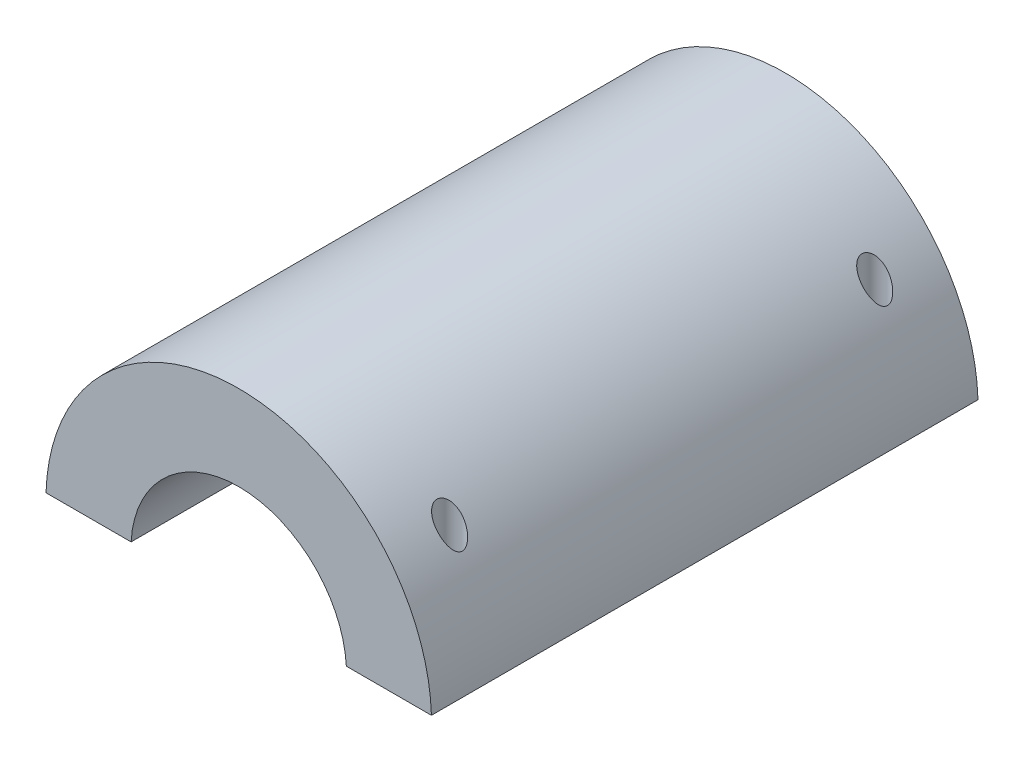
ISO-10303-21;
HEADER;
FILE_DESCRIPTION(('STEP AP214'),'2;1');
FILE_NAME('part.step','',(''),(''),'','','');
FILE_SCHEMA(('AUTOMOTIVE_DESIGN { 1 0 10303 214 1 1 1 1 }'));
ENDSEC;
DATA;
#1=APPLICATION_CONTEXT('core data for automotive mechanical design processes');
#2=APPLICATION_PROTOCOL_DEFINITION('international standard','automotive_design',2000,#1);
#3=PRODUCT_CONTEXT('',#1,'mechanical');
#4=PRODUCT('Part','Part','',(#3));
#5=PRODUCT_RELATED_PRODUCT_CATEGORY('part','',(#4));
#6=PRODUCT_DEFINITION_FORMATION('','',#4);
#7=PRODUCT_DEFINITION_CONTEXT('part definition',#1,'design');
#8=PRODUCT_DEFINITION('design','',#6,#7);
#9=PRODUCT_DEFINITION_SHAPE('','',#8);
#10=(LENGTH_UNIT() NAMED_UNIT(*) SI_UNIT(.MILLI.,.METRE.));
#11=(NAMED_UNIT(*) PLANE_ANGLE_UNIT() SI_UNIT($,.RADIAN.));
#12=(NAMED_UNIT(*) SI_UNIT($,.STERADIAN.) SOLID_ANGLE_UNIT());
#13=UNCERTAINTY_MEASURE_WITH_UNIT(LENGTH_MEASURE(1.E-05),#10,'distance_accuracy_value','');
#14=(GEOMETRIC_REPRESENTATION_CONTEXT(3) GLOBAL_UNCERTAINTY_ASSIGNED_CONTEXT((#13)) GLOBAL_UNIT_ASSIGNED_CONTEXT((#10,
#11,#12)) REPRESENTATION_CONTEXT('',''));
#15=CARTESIAN_POINT('',(0.,0.,0.));
#16=DIRECTION('',(0.,0.,1.));
#17=DIRECTION('',(1.,0.,0.));
#18=AXIS2_PLACEMENT_3D('',#15,#16,#17);
#19=CARTESIAN_POINT('',(17.7218085984473,1.,90.));
#20=DIRECTION('',(0.,1.,0.));
#21=DIRECTION('',(0.,0.,1.));
#22=AXIS2_PLACEMENT_3D('',#19,#20,#21);
#23=PLANE('',#22);
#24=CARTESIAN_POINT('',(24.7280283297466,1.,80.));
#25=DIRECTION('',(0.,-1.,0.));
#26=DIRECTION('',(0.,0.,-1.));
#27=AXIS2_PLACEMENT_3D('',#24,#25,#26);
#28=CIRCLE('',#27,2.1);
#29=CARTESIAN_POINT('',(24.7280283297466,1.,77.9));
#30=VERTEX_POINT('',#29);
#31=EDGE_CURVE('E145',#30,#30,#28,.T.);
#32=ORIENTED_EDGE('',*,*,#31,.F.);
#33=EDGE_LOOP('',(#32));
#34=FACE_BOUND('',#33,.T.);
#35=DIRECTION('',(1.,0.,0.));
#36=VECTOR('',#35,1.);
#37=CARTESIAN_POINT('',(17.7218085984473,1.,0.));
#38=LINE('',#37,#36);
#39=CARTESIAN_POINT('',(17.7218085984473,1.,0.));
#40=VERTEX_POINT('',#39);
#41=CARTESIAN_POINT('',(31.734248061046,1.,0.));
#42=VERTEX_POINT('',#41);
#43=EDGE_CURVE('E80',#40,#42,#38,.T.);
#44=ORIENTED_EDGE('',*,*,#43,.T.);
#45=DIRECTION('',(0.,0.,-1.));
#46=VECTOR('',#45,1.);
#47=CARTESIAN_POINT('',(31.734248061046,1.,90.));
#48=LINE('',#47,#46);
#49=CARTESIAN_POINT('',(31.734248061046,1.,90.));
#50=VERTEX_POINT('',#49);
#51=EDGE_CURVE('E100',#50,#42,#48,.T.);
#52=ORIENTED_EDGE('',*,*,#51,.F.);
#53=DIRECTION('',(1.,0.,0.));
#54=VECTOR('',#53,1.);
#55=CARTESIAN_POINT('',(17.7218085984473,1.,90.));
#56=LINE('',#55,#54);
#57=CARTESIAN_POINT('',(17.7218085984473,1.,90.));
#58=VERTEX_POINT('',#57);
#59=EDGE_CURVE('E57',#58,#50,#56,.T.);
#60=ORIENTED_EDGE('',*,*,#59,.F.);
#61=DIRECTION('',(0.,0.,-1.));
#62=VECTOR('',#61,1.);
#63=CARTESIAN_POINT('',(17.7218085984473,1.,90.));
#64=LINE('',#63,#62);
#65=EDGE_CURVE('E97',#58,#40,#64,.T.);
#66=ORIENTED_EDGE('',*,*,#65,.T.);
#67=EDGE_LOOP('',(#44,#52,#60,#66));
#68=FACE_BOUND('',#67,.T.);
#69=CARTESIAN_POINT('',(24.7280283297466,1.,10.0000000000001));
#70=DIRECTION('',(0.,-1.,0.));
#71=DIRECTION('',(0.,0.,-1.));
#72=AXIS2_PLACEMENT_3D('',#69,#70,#71);
#73=CIRCLE('',#72,2.1);
#74=CARTESIAN_POINT('',(24.7280283297466,1.,7.90000000000006));
#75=VERTEX_POINT('',#74);
#76=EDGE_CURVE('E125',#75,#75,#73,.T.);
#77=ORIENTED_EDGE('',*,*,#76,.F.);
#78=EDGE_LOOP('',(#77));
#79=FACE_BOUND('',#78,.T.);
#80=ADVANCED_FACE('F40',(#34,#68,#79),#23,.F.);
#81=CARTESIAN_POINT('',(0.,0.,90.));
#82=DIRECTION('',(0.,0.,-1.));
#83=DIRECTION('',(-1.,0.,0.));
#84=AXIS2_PLACEMENT_3D('',#81,#82,#83);
#85=CYLINDRICAL_SURFACE('',#84,31.75);
#86=CARTESIAN_POINT('',(-24.7280283297466,19.9144950958654,77.9));
#87=CARTESIAN_POINT('',(-24.6428554988149,20.0202557515295,77.9000019193602));
#88=CARTESIAN_POINT('',(-24.557008965641,20.1254602188119,77.9051723099552));
#89=CARTESIAN_POINT('',(-24.3844723968006,20.3341665965845,77.9264692281959));
#90=CARTESIAN_POINT('',(-24.2977820238086,20.4376677776256,77.9426003309251));
#91=CARTESIAN_POINT('',(-24.1244605621036,20.6419673595394,77.9866222893193));
#92=CARTESIAN_POINT('',(-24.0378295689512,20.7427694525141,78.0144961052082));
#93=CARTESIAN_POINT('',(-23.8655769347329,20.9407242274326,78.0830332029018));
#94=CARTESIAN_POINT('',(-23.7799544855246,21.037879990178,78.1236854028697));
#95=CARTESIAN_POINT('',(-23.6030507159638,21.2362368747944,78.2235700029081));
#96=CARTESIAN_POINT('',(-23.5119977842424,21.3369546688765,78.2841936646951));
#97=CARTESIAN_POINT('',(-23.335427850559,21.5299172903328,78.4241434967715));
#98=CARTESIAN_POINT('',(-23.2499033152815,21.6221737227064,78.5034435023705));
#99=CARTESIAN_POINT('',(-23.104938854677,21.776895077098,78.6640519446132));
#100=CARTESIAN_POINT('',(-23.0437481006753,21.8415880808563,78.7416070621418));
#101=CARTESIAN_POINT('',(-22.9302085850994,21.9607555403227,78.9099935111327));
#102=CARTESIAN_POINT('',(-22.8778479577153,22.0152437202112,79.0008067151943));
#103=CARTESIAN_POINT('',(-22.7952391219599,22.1007318385835,79.1744588480943));
#104=CARTESIAN_POINT('',(-22.7626563394566,22.1342620171961,79.2549316442756));
#105=CARTESIAN_POINT('',(-22.7070676415742,22.1912859329778,79.4225133285041));
#106=CARTESIAN_POINT('',(-22.6840555481272,22.2147861449453,79.5096178925122));
#107=CARTESIAN_POINT('',(-22.6491761242215,22.2503474585535,79.6889369469299));
#108=CARTESIAN_POINT('',(-22.6373796882606,22.2623357980016,79.7811800916491));
#109=CARTESIAN_POINT('',(-22.6262218976125,22.2736762761457,79.9671843295312));
#110=CARTESIAN_POINT('',(-22.6268558571594,22.273033176393,80.0609448373916));
#111=CARTESIAN_POINT('',(-22.6397826602446,22.2598921942833,80.2371502586409));
#112=CARTESIAN_POINT('',(-22.6508882404772,22.2486015087383,80.3197794875201));
#113=CARTESIAN_POINT('',(-22.6822830231849,22.2165936802652,80.4813547170553));
#114=CARTESIAN_POINT('',(-22.7025731787321,22.1958755590628,80.5603003345294));
#115=CARTESIAN_POINT('',(-22.7520393018955,22.1451686891129,80.7158086867132));
#116=CARTESIAN_POINT('',(-22.7815249866583,22.1148561531806,80.7921653239098));
#117=CARTESIAN_POINT('',(-22.8475127996441,22.0466758708029,80.9381313435327));
#118=CARTESIAN_POINT('',(-22.8840186265449,22.0088041412707,81.0077371399558));
#119=CARTESIAN_POINT('',(-22.9832647784215,21.9052387081702,81.1745411139535));
#120=CARTESIAN_POINT('',(-23.0496992365125,21.835393710958,81.2669761678225));
#121=CARTESIAN_POINT('',(-23.1911058420834,21.6851525408156,81.4352742845386));
#122=CARTESIAN_POINT('',(-23.266098344869,21.6047311397013,81.5110965295361));
#123=CARTESIAN_POINT('',(-23.4553236981815,21.3994678020596,81.6769779128811));
#124=CARTESIAN_POINT('',(-23.5723792466759,21.2705761092943,81.7587707849483));
#125=CARTESIAN_POINT('',(-23.8111791497816,21.0029190650672,81.8942760331488));
#126=CARTESIAN_POINT('',(-23.9329304282464,20.8641388561027,81.9479450976505));
#127=CARTESIAN_POINT('',(-24.1422836071243,20.6211189870472,82.0187486850744));
#128=CARTESIAN_POINT('',(-24.2296708433654,20.5183809668016,82.0419458613788));
#129=CARTESIAN_POINT('',(-24.4041000502553,20.3106078604613,82.0767731292156));
#130=CARTESIAN_POINT('',(-24.4911418568186,20.2055718084444,82.0883982574038));
#131=CARTESIAN_POINT('',(-24.6643158750043,19.9938184267603,82.1008308256511));
#132=CARTESIAN_POINT('',(-24.7504460708589,19.8870983095189,82.1016179041554));
#133=CARTESIAN_POINT('',(-24.921091699947,19.6728351520505,82.0928508215475));
#134=CARTESIAN_POINT('',(-25.0056073924316,19.5652922478946,82.0832983351743));
#135=CARTESIAN_POINT('',(-25.1747836870916,19.3471525975669,82.053771239076));
#136=CARTESIAN_POINT('',(-25.2593898625407,19.236549788208,82.0335296447154));
#137=CARTESIAN_POINT('',(-25.4260159324306,19.0157656894158,81.9825257215204));
#138=CARTESIAN_POINT('',(-25.5080350949676,18.9055845268835,81.9517604440306));
#139=CARTESIAN_POINT('',(-25.6687564916281,18.6867817601804,81.8795671788701));
#140=CARTESIAN_POINT('',(-25.7474672489248,18.5781566931903,81.8381688290725));
#141=CARTESIAN_POINT('',(-25.9011673379522,18.3632637633046,81.7440933108116));
#142=CARTESIAN_POINT('',(-25.9761593010339,18.2569942639688,81.6914242617087));
#143=CARTESIAN_POINT('',(-26.1205170834076,18.0498413692962,81.5746328904915));
#144=CARTESIAN_POINT('',(-26.1899520860279,17.9489000238142,81.5107007277078));
#145=CARTESIAN_POINT('',(-26.3232470552563,17.7528354518744,81.3692089690415));
#146=CARTESIAN_POINT('',(-26.3871072257952,17.6577120126321,81.2916498719535));
#147=CARTESIAN_POINT('',(-26.4965800965095,17.4929062465643,81.1356285204378));
#148=CARTESIAN_POINT('',(-26.5434316012945,17.4216825530964,81.0596912292399));
#149=CARTESIAN_POINT('',(-26.6297303554376,17.2894806044257,80.8955909389648));
#150=CARTESIAN_POINT('',(-26.6691957503534,17.2284772804401,80.8074588517448));
#151=CARTESIAN_POINT('',(-26.7254441194643,17.1410279776693,80.6515895516091));
#152=CARTESIAN_POINT('',(-26.7453229032444,17.1099738728752,80.5875808479502));
#153=CARTESIAN_POINT('',(-26.7793877278283,17.056608512029,80.4545587231015));
#154=CARTESIAN_POINT('',(-26.7935796384358,17.0342882417618,80.3855505495525));
#155=CARTESIAN_POINT('',(-26.8151647549225,17.0002901297496,80.2430867423419));
#156=CARTESIAN_POINT('',(-26.8224873620715,16.988722811353,80.169593020583));
#157=CARTESIAN_POINT('',(-26.8292265068126,16.9780786117845,80.0213535704679));
#158=CARTESIAN_POINT('',(-26.8286487705361,16.9789926841589,79.9466087881162));
#159=CARTESIAN_POINT('',(-26.8202819112474,16.9922045646084,79.808650194318));
#160=CARTESIAN_POINT('',(-26.8134580739956,17.0029785575933,79.7452203563267));
#161=CARTESIAN_POINT('',(-26.7945304503923,17.0327903681731,79.6211695141527));
#162=CARTESIAN_POINT('',(-26.7824234350479,17.0518332395376,79.5605502528541));
#163=CARTESIAN_POINT('',(-26.7478767474019,17.1059926942891,79.4190821017041));
#164=CARTESIAN_POINT('',(-26.7232365969373,17.1444975600091,79.3400793172437));
#165=CARTESIAN_POINT('',(-26.6673020363706,17.2313716570841,79.1902772705965));
#166=CARTESIAN_POINT('',(-26.6359918683185,17.2797642369489,79.1194980595573));
#167=CARTESIAN_POINT('',(-26.5751520332814,17.3731477688196,78.9991348213346));
#168=CARTESIAN_POINT('',(-26.5464980496618,17.4169139638338,78.9481294516009));
#169=CARTESIAN_POINT('',(-26.4866275094666,17.5078278883985,78.8508303202345));
#170=CARTESIAN_POINT('',(-26.4554093763629,17.5549776960275,78.8045394970385));
#171=CARTESIAN_POINT('',(-26.358512223855,17.7004192153918,78.6720134459616));
#172=CARTESIAN_POINT('',(-26.2896778062773,17.8025682705054,78.5922888794203));
#173=CARTESIAN_POINT('',(-26.1569668453881,17.9968703332074,78.4587064421331));
#174=CARTESIAN_POINT('',(-26.0939130150052,18.0882011951605,78.4027602912448));
#175=CARTESIAN_POINT('',(-25.9642825507963,18.2737882226707,78.3004423051816));
#176=CARTESIAN_POINT('',(-25.8977034806031,18.3680463922479,78.2540772030984));
#177=CARTESIAN_POINT('',(-25.7616671805024,18.5583591042926,78.1702539907357));
#178=CARTESIAN_POINT('',(-25.6922105406027,18.6544132763189,78.1327940650761));
#179=CARTESIAN_POINT('',(-25.5508534500781,18.847565242713,78.066336981402));
#180=CARTESIAN_POINT('',(-25.4789538501434,18.9446626659063,78.0373369105332));
#181=CARTESIAN_POINT('',(-25.2970797456518,19.1873183025786,77.9752941595375));
#182=CARTESIAN_POINT('',(-25.1857869306761,19.3332006822458,77.9472900609486));
#183=CARTESIAN_POINT('',(-24.9594260049616,19.6245664464409,77.9096357632991));
#184=CARTESIAN_POINT('',(-24.8443555124835,19.7700495140617,77.8999973785799));
#185=CARTESIAN_POINT('',(-24.7280283297466,19.9144950958654,77.9));
#186=B_SPLINE_CURVE_WITH_KNOTS('',3,(#86,#87,#88,#89,#90,#91,#92,#93,#94,#95,#96,#97,#98,#99,
#100,#101,#102,#103,#104,#105,#106,#107,#108,#109,#110,#111,#112,#113,#114,#115,#116,#117,#118,
#119,#120,#121,#122,#123,#124,#125,#126,#127,#128,#129,#130,#131,#132,#133,#134,#135,#136,#137,
#138,#139,#140,#141,#142,#143,#144,#145,#146,#147,#148,#149,#150,#151,#152,#153,#154,#155,#156,
#157,#158,#159,#160,#161,#162,#163,#164,#165,#166,#167,#168,#169,#170,#171,#172,#173,#174,#175,
#176,#177,#178,#179,#180,#181,#182,#183,#184,#185),.UNSPECIFIED.,.T.,.F.,(4,2,2,2,2,2,2,2,2,2,2,
2,2,2,2,2,2,2,2,2,2,2,2,2,2,2,2,2,2,2,2,2,2,2,2,2,2,2,2,2,2,2,2,2,2,2,2,2,2,4),(0.,
0.407246596628123,0.814663285546322,1.22149080007744,1.62796646924282,2.07279693971113,
2.51700789194792,2.87003975606011,3.22259337357175,3.50069304336051,3.77861291465773,
4.05827806990376,4.337837804509,4.58908494807765,4.84035816923152,5.10122616829727,
5.36223198841304,5.76063240652758,6.16000098661436,6.7339557195915,7.30879178400909,
7.71885919733601,8.12910241617638,8.54011625822713,8.95106353675495,9.37279760794445,
9.79464994271635,10.2153389606195,10.6357259302304,11.0495975488097,11.463454021357,
11.8050087185405,12.1457129709323,12.366590931826,12.5872403188367,12.8101333380588,
13.0328648140428,13.2260954347111,13.4194443205825,13.6917381706093,13.9646825953361,
14.1835650383086,14.4025830799051,14.8413006952127,15.2137204733245,15.5864010863791,
15.9590056607126,16.3314817898938,16.8873328028758,17.4435412645025),.UNSPECIFIED.);
#187=CARTESIAN_POINT('',(-24.7280283297466,19.9144950958654,77.9));
#188=VERTEX_POINT('',#187);
#189=EDGE_CURVE('E167',#188,#188,#186,.T.);
#190=ORIENTED_EDGE('',*,*,#189,.T.);
#191=EDGE_LOOP('',(#190));
#192=FACE_BOUND('',#191,.T.);
#193=CARTESIAN_POINT('',(-24.7280283297466,19.9144950958654,7.90000000000001));
#194=CARTESIAN_POINT('',(-24.6428554988149,20.0202557515295,7.90000191936025));
#195=CARTESIAN_POINT('',(-24.557008965641,20.1254602188119,7.90517230995521));
#196=CARTESIAN_POINT('',(-24.3844723968006,20.3341665965846,7.92646922819595));
#197=CARTESIAN_POINT('',(-24.2977820238086,20.4376677776256,7.94260033092508));
#198=CARTESIAN_POINT('',(-24.1244605621036,20.6419673595394,7.98662228931932));
#199=CARTESIAN_POINT('',(-24.0378295689512,20.7427694525141,8.01449610520817));
#200=CARTESIAN_POINT('',(-23.8655769347329,20.9407242274326,8.08303320290177));
#201=CARTESIAN_POINT('',(-23.7799544855246,21.037879990178,8.12368540286967));
#202=CARTESIAN_POINT('',(-23.6030507159638,21.2362368747944,8.22357000290813));
#203=CARTESIAN_POINT('',(-23.5119977842424,21.3369546688765,8.28419366469511));
#204=CARTESIAN_POINT('',(-23.335427850559,21.5299172903328,8.42414349677148));
#205=CARTESIAN_POINT('',(-23.2499033152815,21.6221737227063,8.50344350237054));
#206=CARTESIAN_POINT('',(-23.104938854677,21.776895077098,8.66405194461319));
#207=CARTESIAN_POINT('',(-23.0437481006753,21.8415880808563,8.74160706214182));
#208=CARTESIAN_POINT('',(-22.9302085850994,21.9607555403227,8.90999351113273));
#209=CARTESIAN_POINT('',(-22.8778479577153,22.0152437202112,9.00080671519433));
#210=CARTESIAN_POINT('',(-22.7952391219599,22.1007318385835,9.17445884809428));
#211=CARTESIAN_POINT('',(-22.7626563394566,22.1342620171961,9.25493164427564));
#212=CARTESIAN_POINT('',(-22.7070676415742,22.1912859329778,9.42251332850407));
#213=CARTESIAN_POINT('',(-22.6840555481272,22.2147861449453,9.50961789251218));
#214=CARTESIAN_POINT('',(-22.6491761242215,22.2503474585535,9.68893694692987));
#215=CARTESIAN_POINT('',(-22.6373796882606,22.2623357980016,9.78118009164905));
#216=CARTESIAN_POINT('',(-22.6262218976126,22.2736762761457,9.96718432953114));
#217=CARTESIAN_POINT('',(-22.6268558571594,22.273033176393,10.0609448373916));
#218=CARTESIAN_POINT('',(-22.6397826602446,22.2598921942833,10.2371502586409));
#219=CARTESIAN_POINT('',(-22.6508882404772,22.2486015087383,10.3197794875201));
#220=CARTESIAN_POINT('',(-22.6822830231849,22.2165936802653,10.4813547170553));
#221=CARTESIAN_POINT('',(-22.7025731787321,22.1958755590628,10.5603003345294));
#222=CARTESIAN_POINT('',(-22.7520393018955,22.1451686891129,10.7158086867132));
#223=CARTESIAN_POINT('',(-22.7815249866583,22.1148561531806,10.7921653239098));
#224=CARTESIAN_POINT('',(-22.8475127996441,22.0466758708029,10.9381313435327));
#225=CARTESIAN_POINT('',(-22.8840186265449,22.0088041412707,11.0077371399558));
#226=CARTESIAN_POINT('',(-22.9832647784215,21.9052387081702,11.1745411139535));
#227=CARTESIAN_POINT('',(-23.0496992365125,21.835393710958,11.2669761678225));
#228=CARTESIAN_POINT('',(-23.1911058420834,21.6851525408156,11.4352742845386));
#229=CARTESIAN_POINT('',(-23.266098344869,21.6047311397013,11.5110965295361));
#230=CARTESIAN_POINT('',(-23.4553236981815,21.3994678020596,11.6769779128811));
#231=CARTESIAN_POINT('',(-23.5723792466759,21.2705761092943,11.7587707849483));
#232=CARTESIAN_POINT('',(-23.8111791497816,21.0029190650672,11.8942760331488));
#233=CARTESIAN_POINT('',(-23.9329304282464,20.8641388561027,11.9479450976505));
#234=CARTESIAN_POINT('',(-24.1422836071243,20.6211189870472,12.0187486850744));
#235=CARTESIAN_POINT('',(-24.2296708433654,20.5183809668016,12.0419458613788));
#236=CARTESIAN_POINT('',(-24.4041000502553,20.3106078604613,12.0767731292156));
#237=CARTESIAN_POINT('',(-24.4911418568186,20.2055718084444,12.0883982574038));
#238=CARTESIAN_POINT('',(-24.6643158750043,19.9938184267603,12.1008308256511));
#239=CARTESIAN_POINT('',(-24.7504460708589,19.8870983095189,12.1016179041554));
#240=CARTESIAN_POINT('',(-24.921091699947,19.6728351520505,12.0928508215475));
#241=CARTESIAN_POINT('',(-25.0056073924316,19.5652922478946,12.0832983351743));
#242=CARTESIAN_POINT('',(-25.1747836870916,19.3471525975669,12.053771239076));
#243=CARTESIAN_POINT('',(-25.2593898625407,19.236549788208,12.0335296447154));
#244=CARTESIAN_POINT('',(-25.4260159324306,19.0157656894158,11.9825257215204));
#245=CARTESIAN_POINT('',(-25.5080350949676,18.9055845268835,11.9517604440306));
#246=CARTESIAN_POINT('',(-25.6687564916281,18.6867817601804,11.8795671788701));
#247=CARTESIAN_POINT('',(-25.7474672489248,18.5781566931904,11.8381688290725));
#248=CARTESIAN_POINT('',(-25.9011673379522,18.3632637633046,11.7440933108115));
#249=CARTESIAN_POINT('',(-25.9761593010339,18.2569942639688,11.6914242617087));
#250=CARTESIAN_POINT('',(-26.1205170834076,18.0498413692962,11.5746328904915));
#251=CARTESIAN_POINT('',(-26.1899520860279,17.9489000238142,11.5107007277078));
#252=CARTESIAN_POINT('',(-26.3232470552563,17.7528354518744,11.3692089690415));
#253=CARTESIAN_POINT('',(-26.3871072257952,17.6577120126321,11.2916498719535));
#254=CARTESIAN_POINT('',(-26.4965800965095,17.4929062465643,11.1356285204378));
#255=CARTESIAN_POINT('',(-26.5434316012945,17.4216825530964,11.0596912292399));
#256=CARTESIAN_POINT('',(-26.6297303554376,17.2894806044257,10.8955909389648));
#257=CARTESIAN_POINT('',(-26.6691957503534,17.2284772804401,10.8074588517448));
#258=CARTESIAN_POINT('',(-26.7254441194643,17.1410279776693,10.6515895516091));
#259=CARTESIAN_POINT('',(-26.7453229032444,17.1099738728752,10.5875808479502));
#260=CARTESIAN_POINT('',(-26.7793877278283,17.056608512029,10.4545587231015));
#261=CARTESIAN_POINT('',(-26.7935796384358,17.0342882417618,10.3855505495525));
#262=CARTESIAN_POINT('',(-26.8151647549225,17.0002901297496,10.2430867423418));
#263=CARTESIAN_POINT('',(-26.8224873620715,16.9887228113531,10.169593020583));
#264=CARTESIAN_POINT('',(-26.8292265068126,16.9780786117845,10.0213535704679));
#265=CARTESIAN_POINT('',(-26.8286487705361,16.9789926841589,9.94660878811617));
#266=CARTESIAN_POINT('',(-26.8202819112474,16.9922045646084,9.80865019431801));
#267=CARTESIAN_POINT('',(-26.8134580739956,17.0029785575933,9.74522035632666));
#268=CARTESIAN_POINT('',(-26.7945304503923,17.0327903681731,9.62116951415268));
#269=CARTESIAN_POINT('',(-26.7824234350479,17.0518332395376,9.56055025285406));
#270=CARTESIAN_POINT('',(-26.7478767474019,17.1059926942891,9.4190821017041));
#271=CARTESIAN_POINT('',(-26.7232365969373,17.1444975600091,9.34007931724375));
#272=CARTESIAN_POINT('',(-26.6673020363706,17.2313716570841,9.19027727059651));
#273=CARTESIAN_POINT('',(-26.6359918683185,17.2797642369489,9.11949805955729));
#274=CARTESIAN_POINT('',(-26.5751520332814,17.3731477688196,8.99913482133458));
#275=CARTESIAN_POINT('',(-26.5464980496618,17.4169139638338,8.94812945160096));
#276=CARTESIAN_POINT('',(-26.4866275094666,17.5078278883985,8.85083032023451));
#277=CARTESIAN_POINT('',(-26.455409376363,17.5549776960275,8.80453949703849));
#278=CARTESIAN_POINT('',(-26.358512223855,17.7004192153918,8.67201344596156));
#279=CARTESIAN_POINT('',(-26.2896778062773,17.8025682705054,8.59228887942031));
#280=CARTESIAN_POINT('',(-26.1569668453881,17.9968703332074,8.45870644213313));
#281=CARTESIAN_POINT('',(-26.0939130150052,18.0882011951605,8.40276029124482));
#282=CARTESIAN_POINT('',(-25.9642825507963,18.2737882226707,8.3004423051816));
#283=CARTESIAN_POINT('',(-25.8977034806031,18.3680463922479,8.25407720309839));
#284=CARTESIAN_POINT('',(-25.7616671805024,18.5583591042926,8.17025399073565));
#285=CARTESIAN_POINT('',(-25.6922105406027,18.6544132763189,8.13279406507609));
#286=CARTESIAN_POINT('',(-25.5508534500781,18.847565242713,8.066336981402));
#287=CARTESIAN_POINT('',(-25.4789538501434,18.9446626659063,8.03733691053319));
#288=CARTESIAN_POINT('',(-25.2970797456518,19.1873183025786,7.97529415953751));
#289=CARTESIAN_POINT('',(-25.1857869306761,19.3332006822458,7.94729006094857));
#290=CARTESIAN_POINT('',(-24.9594260049616,19.6245664464409,7.90963576329909));
#291=CARTESIAN_POINT('',(-24.8443555124835,19.7700495140617,7.89999737857992));
#292=CARTESIAN_POINT('',(-24.7280283297466,19.9144950958654,7.90000000000001));
#293=B_SPLINE_CURVE_WITH_KNOTS('',3,(#193,#194,#195,#196,#197,#198,#199,#200,#201,#202,#203,
#204,#205,#206,#207,#208,#209,#210,#211,#212,#213,#214,#215,#216,#217,#218,#219,#220,#221,#222,
#223,#224,#225,#226,#227,#228,#229,#230,#231,#232,#233,#234,#235,#236,#237,#238,#239,#240,#241,
#242,#243,#244,#245,#246,#247,#248,#249,#250,#251,#252,#253,#254,#255,#256,#257,#258,#259,#260,
#261,#262,#263,#264,#265,#266,#267,#268,#269,#270,#271,#272,#273,#274,#275,#276,#277,#278,#279,
#280,#281,#282,#283,#284,#285,#286,#287,#288,#289,#290,#291,#292),.UNSPECIFIED.,.T.,.F.,(4,2,2,
2,2,2,2,2,2,2,2,2,2,2,2,2,2,2,2,2,2,2,2,2,2,2,2,2,2,2,2,2,2,2,2,2,2,2,2,2,2,2,2,2,2,2,2,2,2,4),
(0.,0.407246596628126,0.814663285546325,1.22149080007744,1.62796646924283,2.07279693971112,
2.51700789194793,2.87003975606011,3.22259337357175,3.50069304336051,3.77861291465773,
4.05827806990375,4.337837804509,4.58908494807764,4.84035816923153,5.10122616829727,
5.36223198841303,5.76063240652757,6.16000098661437,6.73395571959151,7.30879178400909,
7.71885919733601,8.12910241617639,8.54011625822714,8.95106353675495,9.37279760794445,
9.79464994271634,10.2153389606195,10.6357259302304,11.0495975488097,11.463454021357,
11.8050087185405,12.1457129709323,12.366590931826,12.5872403188368,12.8101333380588,
13.0328648140428,13.2260954347111,13.4194443205825,13.6917381706093,13.9646825953361,
14.1835650383085,14.4025830799051,14.8413006952127,15.2137204733245,15.5864010863791,
15.9590056607126,16.3314817898938,16.8873328028758,17.4435412645026),.UNSPECIFIED.);
#294=CARTESIAN_POINT('',(-24.7280283297466,19.9144950958654,7.90000000000001));
#295=VERTEX_POINT('',#294);
#296=EDGE_CURVE('E148',#295,#295,#293,.T.);
#297=ORIENTED_EDGE('',*,*,#296,.T.);
#298=EDGE_LOOP('',(#297));
#299=FACE_BOUND('',#298,.T.);
#300=CARTESIAN_POINT('',(24.7280283297466,19.9144950958654,77.9));
#301=CARTESIAN_POINT('',(24.8238481285202,19.7955156519236,77.9000020966215));
#302=CARTESIAN_POINT('',(24.9187864613373,19.6758673592113,77.90654289352));
#303=CARTESIAN_POINT('',(25.1063356494559,19.4359870815876,77.9321875265086));
#304=CARTESIAN_POINT('',(25.1989452368265,19.3157548194812,77.9512980589822));
#305=CARTESIAN_POINT('',(25.3812275979881,19.0755998843802,78.0019300390078));
#306=CARTESIAN_POINT('',(25.4708993692296,18.9556773296747,78.0334556764809));
#307=CARTESIAN_POINT('',(25.6465939428124,18.7172821701763,78.1091322043946));
#308=CARTESIAN_POINT('',(25.7326190105552,18.5988086987254,78.1532751207413));
#309=CARTESIAN_POINT('',(25.9141742396761,18.3451931893672,78.2632989437302));
#310=CARTESIAN_POINT('',(26.0089474549925,18.2105064018919,78.3315584077479));
#311=CARTESIAN_POINT('',(26.14525210073,18.0137363176988,78.449175863811));
#312=CARTESIAN_POINT('',(26.1896902719248,17.9490541351349,78.490894960391));
#313=CARTESIAN_POINT('',(26.2762896393842,17.8220368736102,78.5798795415026));
#314=CARTESIAN_POINT('',(26.3184516274389,17.7597009807869,78.6271430789615));
#315=CARTESIAN_POINT('',(26.4137150247483,17.6178228001425,78.7446287363201));
#316=CARTESIAN_POINT('',(26.4657522354873,17.5395081500462,78.8172392008564));
#317=CARTESIAN_POINT('',(26.5631652523676,17.3916228107032,78.9748963226272));
#318=CARTESIAN_POINT('',(26.6085514185156,17.3220385474148,79.0599232178469));
#319=CARTESIAN_POINT('',(26.67691442877,17.216485676486,79.2147830055472));
#320=CARTESIAN_POINT('',(26.7024442588824,17.1768367809802,79.280949684006));
#321=CARTESIAN_POINT('',(26.74758862232,17.1064533908265,79.4197605070659));
#322=CARTESIAN_POINT('',(26.7672126965525,17.0757045210535,79.4923939556934));
#323=CARTESIAN_POINT('',(26.7960624321005,17.0303885097551,79.6295682476036));
#324=CARTESIAN_POINT('',(26.8065252488433,17.0139029867743,79.6932055802882));
#325=CARTESIAN_POINT('',(26.8215583127947,16.990194613202,79.8228610051128));
#326=CARTESIAN_POINT('',(26.8261337036509,16.9829636772163,79.8888769672071));
#327=CARTESIAN_POINT('',(26.8289679227178,16.9784860779909,80.0215608619936));
#328=CARTESIAN_POINT('',(26.8272107882977,16.9812646460714,80.0882300192211));
#329=CARTESIAN_POINT('',(26.8175216775546,16.9965616357498,80.2199825778589));
#330=CARTESIAN_POINT('',(26.8095854270509,17.0090867992005,80.2850648494485));
#331=CARTESIAN_POINT('',(26.7860859899964,17.0460746029359,80.4246924654151));
#332=CARTESIAN_POINT('',(26.7693149344626,17.0724236259294,80.4985273872944));
#333=CARTESIAN_POINT('',(26.7294439710075,17.1347802290189,80.6401379030745));
#334=CARTESIAN_POINT('',(26.7063326102656,17.1708052849426,80.7079022346632));
#335=CARTESIAN_POINT('',(26.642336216677,17.2700144795792,80.8696946041683));
#336=CARTESIAN_POINT('',(26.5983708990682,17.3377242715365,80.9596932787797));
#337=CARTESIAN_POINT('',(26.5029336455195,17.4832673267509,81.1264917552946));
#338=CARTESIAN_POINT('',(26.4514436641448,17.5611248761253,81.2032588328937));
#339=CARTESIAN_POINT('',(26.3509002615777,17.7115652052905,81.3349557599344));
#340=CARTESIAN_POINT('',(26.3025643793985,17.7832921188353,81.3914383123539));
#341=CARTESIAN_POINT('',(26.202725951461,17.9300735484285,81.4968438808927));
#342=CARTESIAN_POINT('',(26.151221259936,18.0051303094814,81.5457616939938));
#343=CARTESIAN_POINT('',(26.0455411250355,18.1576682072763,81.6367737938285));
#344=CARTESIAN_POINT('',(25.9913613446681,18.2351532012119,81.6788564915731));
#345=CARTESIAN_POINT('',(25.8807881828677,18.3917508912574,81.756619494861));
#346=CARTESIAN_POINT('',(25.8243941980906,18.470864028183,81.7922980403852));
#347=CARTESIAN_POINT('',(25.6835927244019,18.6664388044964,81.8724650832997));
#348=CARTESIAN_POINT('',(25.598111140945,18.7835199485422,81.9135787171915));
#349=CARTESIAN_POINT('',(25.4237592116958,19.0188443391827,81.983628934212));
#350=CARTESIAN_POINT('',(25.3348872730032,19.1370881121618,82.0125597146393));
#351=CARTESIAN_POINT('',(25.1543483077976,19.3737816581558,82.0583789137951));
#352=CARTESIAN_POINT('',(25.0626811732915,19.4922314389626,82.0752668666301));
#353=CARTESIAN_POINT('',(24.8771465740789,19.7284723355936,82.0967788589454));
#354=CARTESIAN_POINT('',(24.7832799120952,19.8462636728631,82.1014073043468));
#355=CARTESIAN_POINT('',(24.6126277465108,20.0573098531843,82.098203556996));
#356=CARTESIAN_POINT('',(24.5361200101984,20.150827148851,82.0926464227325));
#357=CARTESIAN_POINT('',(24.3825074275093,20.3364287425243,82.0728271195654));
#358=CARTESIAN_POINT('',(24.3054027051248,20.4285133267451,82.0585667128286));
#359=CARTESIAN_POINT('',(24.1512289155695,20.610551624232,82.0207898061269));
#360=CARTESIAN_POINT('',(24.0741600073544,20.7005086675167,81.997288948022));
#361=CARTESIAN_POINT('',(23.9206513872054,20.87770773478,81.9403197524804));
#362=CARTESIAN_POINT('',(23.8442114066616,20.9649509673749,81.9068559244102));
#363=CARTESIAN_POINT('',(23.6690444612182,21.1627331629345,81.8168848699375));
#364=CARTESIAN_POINT('',(23.5708444509762,21.2719993684502,81.7564423395926));
#365=CARTESIAN_POINT('',(23.3800292481708,21.4815438658487,81.6146195700598));
#366=CARTESIAN_POINT('',(23.2874071851634,21.581833291853,81.5332657667613));
#367=CARTESIAN_POINT('',(23.134096726517,21.7459286072033,81.3706107783884));
#368=CARTESIAN_POINT('',(23.0711935684493,21.8126064839051,81.2943235421002));
#369=CARTESIAN_POINT('',(22.9539348962716,21.9359654914854,81.1282230141469));
#370=CARTESIAN_POINT('',(22.899567186082,21.9926609004018,81.0384293876144));
#371=CARTESIAN_POINT('',(22.8129313459789,22.0824757614373,80.865847961764));
#372=CARTESIAN_POINT('',(22.7784184394896,22.1180461345113,80.7854737111589));
#373=CARTESIAN_POINT('',(22.7189387575112,22.1791376143684,80.6176294878786));
#374=CARTESIAN_POINT('',(22.6939662982841,22.204664704726,80.5301637777246));
#375=CARTESIAN_POINT('',(22.6552529294364,22.2441633532277,80.3495444551249));
#376=CARTESIAN_POINT('',(22.6415901871557,22.2580544970231,80.2563559615973));
#377=CARTESIAN_POINT('',(22.6270076768351,22.272879104423,80.0679723457324));
#378=CARTESIAN_POINT('',(22.6260815626707,22.2738190210782,79.9727782463866));
#379=CARTESIAN_POINT('',(22.6364160306782,22.2633151118199,79.7944803557384));
#380=CARTESIAN_POINT('',(22.646331910798,22.2532377449068,79.7112099925877));
#381=CARTESIAN_POINT('',(22.6755465293715,22.2234677836666,79.5481345871848));
#382=CARTESIAN_POINT('',(22.6948460939538,22.2037743427512,79.4683298507163));
#383=CARTESIAN_POINT('',(22.7422665244593,22.1552021673282,79.3117955798196));
#384=CARTESIAN_POINT('',(22.770613559584,22.1260876320234,79.2352092192262));
#385=CARTESIAN_POINT('',(22.834417607448,22.0602352774659,79.0886038377264));
#386=CARTESIAN_POINT('',(22.8698780093543,22.0234938240727,79.0185879707645));
#387=CARTESIAN_POINT('',(22.9660372040497,21.9232880045709,78.8515973133409));
#388=CARTESIAN_POINT('',(23.0303706917645,21.8557648199394,78.7591399334027));
#389=CARTESIAN_POINT('',(23.1676797033231,21.7101638405601,78.5903138154881));
#390=CARTESIAN_POINT('',(23.2406765957223,21.6320598780159,78.5139862063747));
#391=CARTESIAN_POINT('',(23.424943199068,21.4326840145664,78.3466770593748));
#392=CARTESIAN_POINT('',(23.5390834590453,21.3073792067744,78.2636928309391));
#393=CARTESIAN_POINT('',(23.7722715539068,21.0469085013949,78.1251778566755));
#394=CARTESIAN_POINT('',(23.8913241741116,20.9117328846869,78.069674599424));
#395=CARTESIAN_POINT('',(24.1307151325456,20.6350328238825,77.9827192625056));
#396=CARTESIAN_POINT('',(24.2510538920226,20.4935062478911,77.9512753239989));
#397=CARTESIAN_POINT('',(24.4907170738964,20.2064908422626,77.9099089083023));
#398=CARTESIAN_POINT('',(24.6100409475177,20.0610000281387,77.8999974183323));
#399=CARTESIAN_POINT('',(24.7280283297466,19.9144950958654,77.9));
#400=B_SPLINE_CURVE_WITH_KNOTS('',3,(#300,#301,#302,#303,#304,#305,#306,#307,#308,#309,#310,
#311,#312,#313,#314,#315,#316,#317,#318,#319,#320,#321,#322,#323,#324,#325,#326,#327,#328,#329,
#330,#331,#332,#333,#334,#335,#336,#337,#338,#339,#340,#341,#342,#343,#344,#345,#346,#347,#348,
#349,#350,#351,#352,#353,#354,#355,#356,#357,#358,#359,#360,#361,#362,#363,#364,#365,#366,#367,
#368,#369,#370,#371,#372,#373,#374,#375,#376,#377,#378,#379,#380,#381,#382,#383,#384,#385,#386,
#387,#388,#389,#390,#391,#392,#393,#394,#395,#396,#397,#398,#399),.UNSPECIFIED.,.T.,.F.,(4,2,2,
2,2,2,2,2,2,2,2,2,2,2,2,2,2,2,2,2,2,2,2,2,2,2,2,2,2,2,2,2,2,2,2,2,2,2,2,2,2,2,2,2,2,2,2,2,2,4),
(0.,0.458113007808894,0.916470267998543,1.37498234998296,1.8332052916068,2.3666270027706,
2.63307039866369,2.89942050465646,3.25495595598345,3.60993158237295,3.85294634092113,
4.09556636862062,4.29442280644307,4.49310539180331,4.69228915361971,4.89161081616198,
5.13079375791998,5.37041162575313,5.73109862112348,6.09266524948036,6.40214564831124,
6.71183796960357,7.02205001553829,7.33234718530388,7.78379074531098,8.23544908565173,
8.68712489807544,9.13863836154634,9.50120629976995,9.86370085256969,10.2255844129167,
10.5873044285403,11.0624410321413,11.536979900435,11.8935577432243,12.2496213506545,
12.5317890400311,12.813788364399,13.0977208327755,13.381511824451,13.6337217308067,
13.8859538454464,14.1450631769718,14.4042962557443,14.796060233682,15.18881141765,
15.7518669720813,16.3154846057568,16.8792928713769,17.443388760204),.UNSPECIFIED.);
#401=CARTESIAN_POINT('',(24.7280283297466,19.9144950958654,77.9));
#402=VERTEX_POINT('',#401);
#403=EDGE_CURVE('E139',#402,#402,#400,.T.);
#404=ORIENTED_EDGE('',*,*,#403,.T.);
#405=EDGE_LOOP('',(#404));
#406=FACE_BOUND('',#405,.T.);
#407=CARTESIAN_POINT('',(24.7280283297466,19.9144950958654,7.90000000000006));
#408=CARTESIAN_POINT('',(24.8238481285202,19.7955156519236,7.90000209662154));
#409=CARTESIAN_POINT('',(24.9187864613373,19.6758673592113,7.90654289352007));
#410=CARTESIAN_POINT('',(25.1063356494559,19.4359870815876,7.9321875265086));
#411=CARTESIAN_POINT('',(25.1989452368265,19.3157548194812,7.9512980589822));
#412=CARTESIAN_POINT('',(25.3812275979881,19.0755998843802,8.00193003900782));
#413=CARTESIAN_POINT('',(25.4708993692296,18.9556773296747,8.03345567648095));
#414=CARTESIAN_POINT('',(25.6465939428124,18.7172821701763,8.10913220439466));
#415=CARTESIAN_POINT('',(25.7326190105552,18.5988086987254,8.15327512074137));
#416=CARTESIAN_POINT('',(25.9141742396761,18.3451931893672,8.26329894373023));
#417=CARTESIAN_POINT('',(26.0089474549925,18.2105064018919,8.33155840774799));
#418=CARTESIAN_POINT('',(26.14525210073,18.0137363176988,8.449175863811));
#419=CARTESIAN_POINT('',(26.1896902719248,17.9490541351349,8.49089496039101));
#420=CARTESIAN_POINT('',(26.2762896393842,17.8220368736102,8.57987954150266));
#421=CARTESIAN_POINT('',(26.3184516274389,17.7597009807869,8.62714307896154));
#422=CARTESIAN_POINT('',(26.4137150247483,17.6178228001425,8.74462873632014));
#423=CARTESIAN_POINT('',(26.4657522354873,17.5395081500462,8.81723920085649));
#424=CARTESIAN_POINT('',(26.5631652523676,17.3916228107032,8.97489632262724));
#425=CARTESIAN_POINT('',(26.6085514185156,17.3220385474148,9.05992321784694));
#426=CARTESIAN_POINT('',(26.67691442877,17.2164856764859,9.21478300554722));
#427=CARTESIAN_POINT('',(26.7024442588824,17.1768367809802,9.28094968400609));
#428=CARTESIAN_POINT('',(26.74758862232,17.1064533908265,9.41976050706598));
#429=CARTESIAN_POINT('',(26.7672126965525,17.0757045210535,9.49239395569342));
#430=CARTESIAN_POINT('',(26.7960624321005,17.0303885097551,9.62956824760363));
#431=CARTESIAN_POINT('',(26.8065252488433,17.0139029867742,9.69320558028822));
#432=CARTESIAN_POINT('',(26.8215583127947,16.990194613202,9.82286100511281));
#433=CARTESIAN_POINT('',(26.8261337036509,16.9829636772163,9.88887696720717));
#434=CARTESIAN_POINT('',(26.8289679227178,16.9784860779909,10.0215608619937));
#435=CARTESIAN_POINT('',(26.8272107882977,16.9812646460713,10.0882300192211));
#436=CARTESIAN_POINT('',(26.8175216775546,16.9965616357498,10.2199825778589));
#437=CARTESIAN_POINT('',(26.8095854270509,17.0090867992005,10.2850648494486));
#438=CARTESIAN_POINT('',(26.7860859899964,17.0460746029359,10.4246924654151));
#439=CARTESIAN_POINT('',(26.7693149344626,17.0724236259294,10.4985273872944));
#440=CARTESIAN_POINT('',(26.7294439710075,17.1347802290189,10.6401379030745));
#441=CARTESIAN_POINT('',(26.7063326102656,17.1708052849426,10.7079022346632));
#442=CARTESIAN_POINT('',(26.642336216677,17.2700144795792,10.8696946041683));
#443=CARTESIAN_POINT('',(26.5983708990682,17.3377242715365,10.9596932787797));
#444=CARTESIAN_POINT('',(26.5029336455195,17.4832673267508,11.1264917552946));
#445=CARTESIAN_POINT('',(26.4514436641448,17.5611248761252,11.2032588328937));
#446=CARTESIAN_POINT('',(26.3509002615777,17.7115652052904,11.3349557599344));
#447=CARTESIAN_POINT('',(26.3025643793986,17.7832921188352,11.3914383123539));
#448=CARTESIAN_POINT('',(26.2027259514611,17.9300735484285,11.4968438808927));
#449=CARTESIAN_POINT('',(26.151221259936,18.0051303094814,11.5457616939938));
#450=CARTESIAN_POINT('',(26.0455411250356,18.1576682072762,11.6367737938285));
#451=CARTESIAN_POINT('',(25.9913613446682,18.2351532012118,11.6788564915731));
#452=CARTESIAN_POINT('',(25.8807881828678,18.3917508912574,11.756619494861));
#453=CARTESIAN_POINT('',(25.8243941980906,18.470864028183,11.7922980403852));
#454=CARTESIAN_POINT('',(25.683592724402,18.6664388044963,11.8724650832997));
#455=CARTESIAN_POINT('',(25.598111140945,18.7835199485421,11.9135787171915));
#456=CARTESIAN_POINT('',(25.4237592116958,19.0188443391826,11.983628934212));
#457=CARTESIAN_POINT('',(25.3348872730033,19.1370881121618,12.0125597146393));
#458=CARTESIAN_POINT('',(25.1543483077976,19.3737816581557,12.0583789137951));
#459=CARTESIAN_POINT('',(25.0626811732915,19.4922314389626,12.0752668666302));
#460=CARTESIAN_POINT('',(24.8771465740789,19.7284723355935,12.0967788589455));
#461=CARTESIAN_POINT('',(24.7832799120953,19.846263672863,12.1014073043468));
#462=CARTESIAN_POINT('',(24.6126277465108,20.0573098531843,12.098203556996));
#463=CARTESIAN_POINT('',(24.5361200101985,20.150827148851,12.0926464227325));
#464=CARTESIAN_POINT('',(24.3825074275094,20.3364287425242,12.0728271195654));
#465=CARTESIAN_POINT('',(24.3054027051249,20.428513326745,12.0585667128287));
#466=CARTESIAN_POINT('',(24.1512289155696,20.6105516242319,12.020789806127));
#467=CARTESIAN_POINT('',(24.0741600073544,20.7005086675166,11.9972889480221));
#468=CARTESIAN_POINT('',(23.9206513872055,20.87770773478,11.9403197524804));
#469=CARTESIAN_POINT('',(23.8442114066616,20.9649509673748,11.9068559244102));
#470=CARTESIAN_POINT('',(23.6690444612182,21.1627331629344,11.8168848699375));
#471=CARTESIAN_POINT('',(23.5708444509762,21.2719993684501,11.7564423395927));
#472=CARTESIAN_POINT('',(23.3800292481708,21.4815438658487,11.6146195700599));
#473=CARTESIAN_POINT('',(23.2874071851634,21.581833291853,11.5332657667613));
#474=CARTESIAN_POINT('',(23.1340967265171,21.7459286072033,11.3706107783885));
#475=CARTESIAN_POINT('',(23.0711935684493,21.812606483905,11.2943235421003));
#476=CARTESIAN_POINT('',(22.9539348962717,21.9359654914854,11.128223014147));
#477=CARTESIAN_POINT('',(22.899567186082,21.9926609004018,11.0384293876145));
#478=CARTESIAN_POINT('',(22.8129313459789,22.0824757614373,10.8658479617641));
#479=CARTESIAN_POINT('',(22.7784184394896,22.1180461345113,10.785473711159));
#480=CARTESIAN_POINT('',(22.7189387575113,22.1791376143684,10.6176294878787));
#481=CARTESIAN_POINT('',(22.6939662982841,22.204664704726,10.5301637777247));
#482=CARTESIAN_POINT('',(22.6552529294364,22.2441633532277,10.349544455125));
#483=CARTESIAN_POINT('',(22.6415901871557,22.2580544970231,10.2563559615973));
#484=CARTESIAN_POINT('',(22.6270076768351,22.272879104423,10.0679723457325));
#485=CARTESIAN_POINT('',(22.6260815626707,22.2738190210782,9.97277824638668));
#486=CARTESIAN_POINT('',(22.6364160306782,22.2633151118199,9.7944803557385));
#487=CARTESIAN_POINT('',(22.646331910798,22.2532377449068,9.71120999258773));
#488=CARTESIAN_POINT('',(22.6755465293715,22.2234677836667,9.54813458718483));
#489=CARTESIAN_POINT('',(22.6948460939537,22.2037743427512,9.46832985071636));
#490=CARTESIAN_POINT('',(22.7422665244593,22.1552021673282,9.31179557981965));
#491=CARTESIAN_POINT('',(22.770613559584,22.1260876320234,9.23520921922629));
#492=CARTESIAN_POINT('',(22.834417607448,22.0602352774659,9.08860383772645));
#493=CARTESIAN_POINT('',(22.8698780093543,22.0234938240727,9.01858797076453));
#494=CARTESIAN_POINT('',(22.9660372040497,21.9232880045709,8.85159731334099));
#495=CARTESIAN_POINT('',(23.0303706917645,21.8557648199394,8.75913993340272));
#496=CARTESIAN_POINT('',(23.1676797033231,21.7101638405601,8.5903138154882));
#497=CARTESIAN_POINT('',(23.2406765957223,21.6320598780159,8.51398620637482));
#498=CARTESIAN_POINT('',(23.424943199068,21.4326840145664,8.34667705937489));
#499=CARTESIAN_POINT('',(23.5390834590453,21.3073792067744,8.26369283093917));
#500=CARTESIAN_POINT('',(23.7722715539068,21.0469085013949,8.12517785667557));
#501=CARTESIAN_POINT('',(23.8913241741116,20.911732884687,8.06967459942402));
#502=CARTESIAN_POINT('',(24.1307151325455,20.6350328238825,7.98271926250561));
#503=CARTESIAN_POINT('',(24.2510538920226,20.4935062478912,7.95127532399895));
#504=CARTESIAN_POINT('',(24.4907170738964,20.2064908422626,7.90990890830232));
#505=CARTESIAN_POINT('',(24.6100409475177,20.0610000281387,7.89999741833236));
#506=CARTESIAN_POINT('',(24.7280283297466,19.9144950958654,7.90000000000006));
#507=B_SPLINE_CURVE_WITH_KNOTS('',3,(#407,#408,#409,#410,#411,#412,#413,#414,#415,#416,#417,
#418,#419,#420,#421,#422,#423,#424,#425,#426,#427,#428,#429,#430,#431,#432,#433,#434,#435,#436,
#437,#438,#439,#440,#441,#442,#443,#444,#445,#446,#447,#448,#449,#450,#451,#452,#453,#454,#455,
#456,#457,#458,#459,#460,#461,#462,#463,#464,#465,#466,#467,#468,#469,#470,#471,#472,#473,#474,
#475,#476,#477,#478,#479,#480,#481,#482,#483,#484,#485,#486,#487,#488,#489,#490,#491,#492,#493,
#494,#495,#496,#497,#498,#499,#500,#501,#502,#503,#504,#505,#506),.UNSPECIFIED.,.T.,.F.,(4,2,2,
2,2,2,2,2,2,2,2,2,2,2,2,2,2,2,2,2,2,2,2,2,2,2,2,2,2,2,2,2,2,2,2,2,2,2,2,2,2,2,2,2,2,2,2,2,2,4),
(0.,0.458113007808892,0.916470267998544,1.37498234998296,1.8332052916068,2.36662700277059,
2.63307039866367,2.89942050465646,3.25495595598343,3.60993158237296,3.85294634092116,
4.09556636862063,4.29442280644307,4.49310539180331,4.6922891536197,4.89161081616196,
5.13079375791996,5.37041162575309,5.73109862112342,6.0926652494803,6.40214564831117,
6.71183796960349,7.0220500155382,7.33234718530378,7.78379074531088,8.23544908565163,
8.68712489807534,9.13863836154623,9.50120629976986,9.86370085256961,10.2255844129166,
10.5873044285402,11.0624410321412,11.5369799004349,11.8935577432242,12.2496213506544,
12.5317890400311,12.813788364399,13.0977208327755,13.381511824451,13.6337217308067,
13.8859538454464,14.1450631769718,14.4042962557442,14.796060233682,15.18881141765,
15.7518669720813,16.3154846057568,16.8792928713769,17.443388760204),.UNSPECIFIED.);
#508=CARTESIAN_POINT('',(24.7280283297466,19.9144950958654,7.90000000000006));
#509=VERTEX_POINT('',#508);
#510=EDGE_CURVE('E107',#509,#509,#507,.T.);
#511=ORIENTED_EDGE('',*,*,#510,.T.);
#512=EDGE_LOOP('',(#511));
#513=FACE_BOUND('',#512,.T.);
#514=CARTESIAN_POINT('',(0.,0.,0.));
#515=DIRECTION('',(0.,0.,1.));
#516=DIRECTION('',(1.,0.,0.));
#517=AXIS2_PLACEMENT_3D('',#514,#515,#516);
#518=CIRCLE('',#517,31.75);
#519=CARTESIAN_POINT('',(-31.734248061046,1.,0.));
#520=VERTEX_POINT('',#519);
#521=EDGE_CURVE('E104',#42,#520,#518,.T.);
#522=ORIENTED_EDGE('',*,*,#521,.T.);
#523=DIRECTION('',(0.,0.,-1.));
#524=VECTOR('',#523,1.);
#525=CARTESIAN_POINT('',(-31.734248061046,1.,90.));
#526=LINE('',#525,#524);
#527=CARTESIAN_POINT('',(-31.734248061046,1.,90.));
#528=VERTEX_POINT('',#527);
#529=EDGE_CURVE('E11',#528,#520,#526,.T.);
#530=ORIENTED_EDGE('',*,*,#529,.F.);
#531=CARTESIAN_POINT('',(0.,0.,90.));
#532=DIRECTION('',(0.,0.,1.));
#533=DIRECTION('',(1.,0.,0.));
#534=AXIS2_PLACEMENT_3D('',#531,#532,#533);
#535=CIRCLE('',#534,31.75);
#536=EDGE_CURVE('E92',#50,#528,#535,.T.);
#537=ORIENTED_EDGE('',*,*,#536,.F.);
#538=ORIENTED_EDGE('',*,*,#51,.T.);
#539=EDGE_LOOP('',(#522,#530,#537,#538));
#540=FACE_BOUND('',#539,.T.);
#541=ADVANCED_FACE('F42',(#192,#299,#406,#513,#540),#85,.T.);
#542=CARTESIAN_POINT('',(-31.734248061046,1.,90.));
#543=DIRECTION('',(0.,1.,0.));
#544=DIRECTION('',(0.,0.,1.));
#545=AXIS2_PLACEMENT_3D('',#542,#543,#544);
#546=PLANE('',#545);
#547=CARTESIAN_POINT('',(-24.7280283297466,1.,80.));
#548=DIRECTION('',(0.,-1.,0.));
#549=DIRECTION('',(0.,0.,-1.));
#550=AXIS2_PLACEMENT_3D('',#547,#548,#549);
#551=CIRCLE('',#550,2.1);
#552=CARTESIAN_POINT('',(-24.7280283297466,1.,77.9));
#553=VERTEX_POINT('',#552);
#554=EDGE_CURVE('E173',#553,#553,#551,.T.);
#555=ORIENTED_EDGE('',*,*,#554,.F.);
#556=EDGE_LOOP('',(#555));
#557=FACE_BOUND('',#556,.T.);
#558=CARTESIAN_POINT('',(-24.7280283297466,1.,10.));
#559=DIRECTION('',(0.,-1.,0.));
#560=DIRECTION('',(0.,0.,-1.));
#561=AXIS2_PLACEMENT_3D('',#558,#559,#560);
#562=CIRCLE('',#561,2.1);
#563=CARTESIAN_POINT('',(-24.7280283297466,1.,7.9));
#564=VERTEX_POINT('',#563);
#565=EDGE_CURVE('E155',#564,#564,#562,.T.);
#566=ORIENTED_EDGE('',*,*,#565,.F.);
#567=EDGE_LOOP('',(#566));
#568=FACE_BOUND('',#567,.T.);
#569=DIRECTION('',(1.,0.,0.));
#570=VECTOR('',#569,1.);
#571=CARTESIAN_POINT('',(-31.734248061046,1.,0.));
#572=LINE('',#571,#570);
#573=CARTESIAN_POINT('',(-17.7218085984473,0.999999999999997,0.));
#574=VERTEX_POINT('',#573);
#575=EDGE_CURVE('E96',#520,#574,#572,.T.);
#576=ORIENTED_EDGE('',*,*,#575,.T.);
#577=DIRECTION('',(0.,0.,-1.));
#578=VECTOR('',#577,1.);
#579=CARTESIAN_POINT('',(-17.7218085984473,0.999999999999997,90.));
#580=LINE('',#579,#578);
#581=CARTESIAN_POINT('',(-17.7218085984473,0.999999999999997,90.));
#582=VERTEX_POINT('',#581);
#583=EDGE_CURVE('E49',#582,#574,#580,.T.);
#584=ORIENTED_EDGE('',*,*,#583,.F.);
#585=DIRECTION('',(1.,0.,0.));
#586=VECTOR('',#585,1.);
#587=CARTESIAN_POINT('',(-31.734248061046,1.,90.));
#588=LINE('',#587,#586);
#589=EDGE_CURVE('E87',#528,#582,#588,.T.);
#590=ORIENTED_EDGE('',*,*,#589,.F.);
#591=ORIENTED_EDGE('',*,*,#529,.T.);
#592=EDGE_LOOP('',(#576,#584,#590,#591));
#593=FACE_BOUND('',#592,.T.);
#594=ADVANCED_FACE('F95',(#557,#568,#593),#546,.F.);
#595=CARTESIAN_POINT('',(0.,0.,90.));
#596=DIRECTION('',(0.,0.,-1.));
#597=DIRECTION('',(-1.,0.,0.));
#598=AXIS2_PLACEMENT_3D('',#595,#596,#597);
#599=CYLINDRICAL_SURFACE('',#598,17.75);
#600=CARTESIAN_POINT('',(0.,0.,0.));
#601=DIRECTION('',(0.,0.,-1.));
#602=DIRECTION('',(1.,0.,0.));
#603=AXIS2_PLACEMENT_3D('',#600,#601,#602);
#604=CIRCLE('',#603,17.75);
#605=EDGE_CURVE('E74',#574,#40,#604,.T.);
#606=ORIENTED_EDGE('',*,*,#605,.T.);
#607=ORIENTED_EDGE('',*,*,#65,.F.);
#608=CARTESIAN_POINT('',(0.,0.,90.));
#609=DIRECTION('',(0.,0.,-1.));
#610=DIRECTION('',(1.,0.,0.));
#611=AXIS2_PLACEMENT_3D('',#608,#609,#610);
#612=CIRCLE('',#611,17.75);
#613=EDGE_CURVE('E90',#582,#58,#612,.T.);
#614=ORIENTED_EDGE('',*,*,#613,.F.);
#615=ORIENTED_EDGE('',*,*,#583,.T.);
#616=EDGE_LOOP('',(#606,#607,#614,#615));
#617=FACE_BOUND('',#616,.T.);
#618=ADVANCED_FACE('F98',(#617),#599,.F.);
#619=CARTESIAN_POINT('',(0.,0.,90.));
#620=DIRECTION('',(0.,0.,1.));
#621=DIRECTION('',(1.,0.,0.));
#622=AXIS2_PLACEMENT_3D('',#619,#620,#621);
#623=PLANE('',#622);
#624=ORIENTED_EDGE('',*,*,#536,.T.);
#625=ORIENTED_EDGE('',*,*,#589,.T.);
#626=ORIENTED_EDGE('',*,*,#613,.T.);
#627=ORIENTED_EDGE('',*,*,#59,.T.);
#628=EDGE_LOOP('',(#624,#625,#626,#627));
#629=FACE_BOUND('',#628,.T.);
#630=ADVANCED_FACE('F88',(#629),#623,.T.);
#631=CARTESIAN_POINT('',(0.,0.,0.));
#632=DIRECTION('',(0.,0.,1.));
#633=DIRECTION('',(1.,0.,0.));
#634=AXIS2_PLACEMENT_3D('',#631,#632,#633);
#635=PLANE('',#634);
#636=ORIENTED_EDGE('',*,*,#521,.F.);
#637=ORIENTED_EDGE('',*,*,#43,.F.);
#638=ORIENTED_EDGE('',*,*,#605,.F.);
#639=ORIENTED_EDGE('',*,*,#575,.F.);
#640=EDGE_LOOP('',(#636,#637,#638,#639));
#641=FACE_BOUND('',#640,.T.);
#642=ADVANCED_FACE('F115',(#641),#635,.F.);
#643=CARTESIAN_POINT('',(24.7280283297466,1.,10.0000000000001));
#644=DIRECTION('',(0.,-1.,0.));
#645=DIRECTION('',(0.,0.,-1.));
#646=AXIS2_PLACEMENT_3D('',#643,#644,#645);
#647=CYLINDRICAL_SURFACE('',#646,2.1);
#648=ORIENTED_EDGE('',*,*,#510,.F.);
#649=EDGE_LOOP('',(#648));
#650=FACE_BOUND('',#649,.T.);
#651=ORIENTED_EDGE('',*,*,#76,.T.);
#652=EDGE_LOOP('',(#651));
#653=FACE_BOUND('',#652,.T.);
#654=ADVANCED_FACE('F129',(#650,#653),#647,.F.);
#655=CARTESIAN_POINT('',(24.7280283297466,1.,80.));
#656=DIRECTION('',(0.,-1.,0.));
#657=DIRECTION('',(0.,0.,-1.));
#658=AXIS2_PLACEMENT_3D('',#655,#656,#657);
#659=CYLINDRICAL_SURFACE('',#658,2.1);
#660=ORIENTED_EDGE('',*,*,#403,.F.);
#661=EDGE_LOOP('',(#660));
#662=FACE_BOUND('',#661,.T.);
#663=ORIENTED_EDGE('',*,*,#31,.T.);
#664=EDGE_LOOP('',(#663));
#665=FACE_BOUND('',#664,.T.);
#666=ADVANCED_FACE('F133',(#662,#665),#659,.F.);
#667=CARTESIAN_POINT('',(-24.7280283297466,1.,10.));
#668=DIRECTION('',(0.,-1.,0.));
#669=DIRECTION('',(0.,0.,-1.));
#670=AXIS2_PLACEMENT_3D('',#667,#668,#669);
#671=CYLINDRICAL_SURFACE('',#670,2.1);
#672=ORIENTED_EDGE('',*,*,#296,.F.);
#673=EDGE_LOOP('',(#672));
#674=FACE_BOUND('',#673,.T.);
#675=ORIENTED_EDGE('',*,*,#565,.T.);
#676=EDGE_LOOP('',(#675));
#677=FACE_BOUND('',#676,.T.);
#678=ADVANCED_FACE('F158',(#674,#677),#671,.F.);
#679=CARTESIAN_POINT('',(-24.7280283297466,1.,80.));
#680=DIRECTION('',(0.,-1.,0.));
#681=DIRECTION('',(0.,0.,-1.));
#682=AXIS2_PLACEMENT_3D('',#679,#680,#681);
#683=CYLINDRICAL_SURFACE('',#682,2.1);
#684=ORIENTED_EDGE('',*,*,#189,.F.);
#685=EDGE_LOOP('',(#684));
#686=FACE_BOUND('',#685,.T.);
#687=ORIENTED_EDGE('',*,*,#554,.T.);
#688=EDGE_LOOP('',(#687));
#689=FACE_BOUND('',#688,.T.);
#690=ADVANCED_FACE('F162',(#686,#689),#683,.F.);
#691=CLOSED_SHELL('',(#80,#541,#594,#618,#630,#642,#654,#666,#678,#690));
#692=MANIFOLD_SOLID_BREP('B2',#691);
#693=ADVANCED_BREP_SHAPE_REPRESENTATION('',(#18,#692),#14);
#694=SHAPE_DEFINITION_REPRESENTATION(#9,#693);
ENDSEC;
END-ISO-10303-21;
